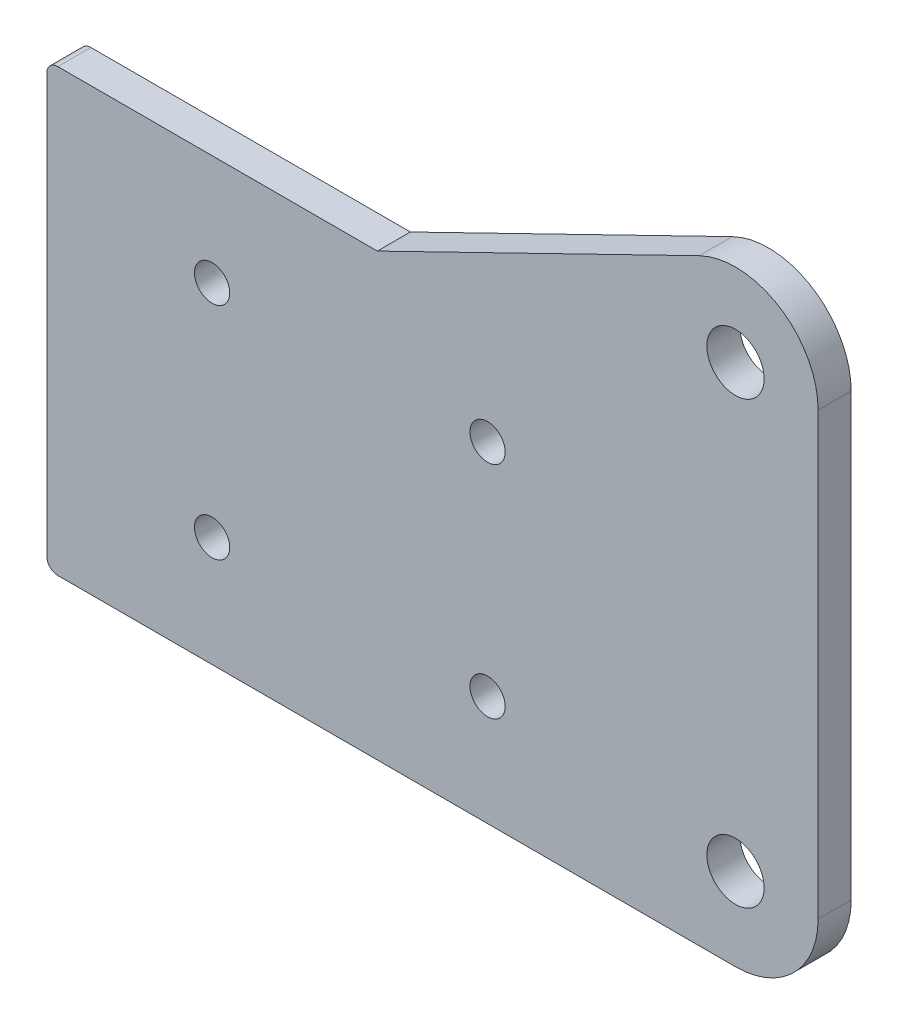
ISO-10303-21;
HEADER;
FILE_DESCRIPTION(('STEP AP214'),'2;1');
FILE_NAME('part.step','',(''),(''),'','','');
FILE_SCHEMA(('AUTOMOTIVE_DESIGN { 1 0 10303 214 1 1 1 1 }'));
ENDSEC;
DATA;
#1=APPLICATION_CONTEXT('core data for automotive mechanical design processes');
#2=APPLICATION_PROTOCOL_DEFINITION('international standard','automotive_design',2000,#1);
#3=PRODUCT_CONTEXT('',#1,'mechanical');
#4=PRODUCT('Part','Part','',(#3));
#5=PRODUCT_RELATED_PRODUCT_CATEGORY('part','',(#4));
#6=PRODUCT_DEFINITION_FORMATION('','',#4);
#7=PRODUCT_DEFINITION_CONTEXT('part definition',#1,'design');
#8=PRODUCT_DEFINITION('design','',#6,#7);
#9=PRODUCT_DEFINITION_SHAPE('','',#8);
#10=(LENGTH_UNIT() NAMED_UNIT(*) SI_UNIT(.MILLI.,.METRE.));
#11=(NAMED_UNIT(*) PLANE_ANGLE_UNIT() SI_UNIT($,.RADIAN.));
#12=(NAMED_UNIT(*) SI_UNIT($,.STERADIAN.) SOLID_ANGLE_UNIT());
#13=UNCERTAINTY_MEASURE_WITH_UNIT(LENGTH_MEASURE(1.E-05),#10,'distance_accuracy_value','');
#14=(GEOMETRIC_REPRESENTATION_CONTEXT(3) GLOBAL_UNCERTAINTY_ASSIGNED_CONTEXT((#13)) GLOBAL_UNIT_ASSIGNED_CONTEXT((#10,
#11,#12)) REPRESENTATION_CONTEXT('',''));
#15=CARTESIAN_POINT('',(0.,0.,0.));
#16=DIRECTION('',(0.,0.,1.));
#17=DIRECTION('',(1.,0.,0.));
#18=AXIS2_PLACEMENT_3D('',#15,#16,#17);
#19=CARTESIAN_POINT('',(27.5,20.,3.));
#20=DIRECTION('',(0.,0.,-1.));
#21=DIRECTION('',(-1.,0.,0.));
#22=AXIS2_PLACEMENT_3D('',#19,#20,#21);
#23=PLANE('',#22);
#24=CARTESIAN_POINT('',(-20.,-17.5,3.));
#25=DIRECTION('',(0.,0.,1.));
#26=DIRECTION('',(-1.,0.,0.));
#27=AXIS2_PLACEMENT_3D('',#24,#25,#26);
#28=CIRCLE('',#27,1.6);
#29=CARTESIAN_POINT('',(-21.6,-17.5,3.));
#30=VERTEX_POINT('',#29);
#31=EDGE_CURVE('E304',#30,#30,#28,.T.);
#32=ORIENTED_EDGE('',*,*,#31,.F.);
#33=EDGE_LOOP('',(#32));
#34=FACE_BOUND('',#33,.T.);
#35=CARTESIAN_POINT('',(4.99999999999999,-17.5,3.));
#36=DIRECTION('',(0.,0.,1.));
#37=DIRECTION('',(1.,0.,0.));
#38=AXIS2_PLACEMENT_3D('',#35,#36,#37);
#39=CIRCLE('',#38,1.6);
#40=CARTESIAN_POINT('',(6.59999999999999,-17.5,3.));
#41=VERTEX_POINT('',#40);
#42=EDGE_CURVE('E296',#41,#41,#39,.T.);
#43=ORIENTED_EDGE('',*,*,#42,.F.);
#44=EDGE_LOOP('',(#43));
#45=FACE_BOUND('',#44,.T.);
#46=CARTESIAN_POINT('',(4.99999999999999,2.49999999999999,3.));
#47=DIRECTION('',(0.,0.,1.));
#48=DIRECTION('',(-1.,0.,0.));
#49=AXIS2_PLACEMENT_3D('',#46,#47,#48);
#50=CIRCLE('',#49,1.6);
#51=CARTESIAN_POINT('',(3.39999999999999,2.49999999999999,3.));
#52=VERTEX_POINT('',#51);
#53=EDGE_CURVE('E289',#52,#52,#50,.T.);
#54=ORIENTED_EDGE('',*,*,#53,.F.);
#55=EDGE_LOOP('',(#54));
#56=FACE_BOUND('',#55,.T.);
#57=CARTESIAN_POINT('',(-20.,2.49999999999999,3.));
#58=DIRECTION('',(0.,0.,1.));
#59=DIRECTION('',(1.,0.,0.));
#60=AXIS2_PLACEMENT_3D('',#57,#58,#59);
#61=CIRCLE('',#60,1.6);
#62=CARTESIAN_POINT('',(-18.4,2.49999999999999,3.));
#63=VERTEX_POINT('',#62);
#64=EDGE_CURVE('E293',#63,#63,#61,.T.);
#65=ORIENTED_EDGE('',*,*,#64,.F.);
#66=EDGE_LOOP('',(#65));
#67=FACE_BOUND('',#66,.T.);
#68=DIRECTION('',(0.,-1.,0.));
#69=VECTOR('',#68,1.);
#70=CARTESIAN_POINT('',(-35.,-27.5,3.));
#71=LINE('',#70,#69);
#72=CARTESIAN_POINT('',(-35.,11.5,3.));
#73=VERTEX_POINT('',#72);
#74=CARTESIAN_POINT('',(-35.,-26.5,3.));
#75=VERTEX_POINT('',#74);
#76=EDGE_CURVE('E158',#73,#75,#71,.T.);
#77=ORIENTED_EDGE('',*,*,#76,.T.);
#78=CARTESIAN_POINT('',(-34.,-26.5,3.));
#79=DIRECTION('',(0.,0.,-1.));
#80=DIRECTION('',(-1.,0.,0.));
#81=AXIS2_PLACEMENT_3D('',#78,#79,#80);
#82=CIRCLE('',#81,1.);
#83=CARTESIAN_POINT('',(-34.,-27.5,3.));
#84=VERTEX_POINT('',#83);
#85=EDGE_CURVE('E46',#75,#84,#82,.F.);
#86=ORIENTED_EDGE('',*,*,#85,.T.);
#87=DIRECTION('',(1.,0.,0.));
#88=VECTOR('',#87,1.);
#89=CARTESIAN_POINT('',(-35.,-27.5,3.));
#90=LINE('',#89,#88);
#91=CARTESIAN_POINT('',(27.4999999999999,-27.5,3.));
#92=VERTEX_POINT('',#91);
#93=EDGE_CURVE('E160',#84,#92,#90,.T.);
#94=ORIENTED_EDGE('',*,*,#93,.T.);
#95=CARTESIAN_POINT('',(27.5,-20.,3.));
#96=DIRECTION('',(0.,0.,1.));
#97=DIRECTION('',(1.,0.,0.));
#98=AXIS2_PLACEMENT_3D('',#95,#96,#97);
#99=CIRCLE('',#98,7.5);
#100=CARTESIAN_POINT('',(35.,-20.,3.));
#101=VERTEX_POINT('',#100);
#102=EDGE_CURVE('E163',#92,#101,#99,.T.);
#103=ORIENTED_EDGE('',*,*,#102,.T.);
#104=DIRECTION('',(0.,1.,0.));
#105=VECTOR('',#104,1.);
#106=CARTESIAN_POINT('',(35.,-20.,3.));
#107=LINE('',#106,#105);
#108=CARTESIAN_POINT('',(35.,19.9999999999999,3.));
#109=VERTEX_POINT('',#108);
#110=EDGE_CURVE('E165',#101,#109,#107,.T.);
#111=ORIENTED_EDGE('',*,*,#110,.T.);
#112=CARTESIAN_POINT('',(27.5,20.,3.));
#113=DIRECTION('',(0.,0.,1.));
#114=DIRECTION('',(-1.,0.,0.));
#115=AXIS2_PLACEMENT_3D('',#112,#113,#114);
#116=CIRCLE('',#115,7.5);
#117=CARTESIAN_POINT('',(24.2134831460674,26.7415730337079,3.));
#118=VERTEX_POINT('',#117);
#119=EDGE_CURVE('E167',#109,#118,#116,.T.);
#120=ORIENTED_EDGE('',*,*,#119,.T.);
#121=DIRECTION('',(0.898876404494382,0.438202247191011,0.));
#122=VECTOR('',#121,1.);
#123=CARTESIAN_POINT('',(-5.00000000000001,12.5,3.));
#124=LINE('',#123,#122);
#125=CARTESIAN_POINT('',(-5.00000000000001,12.5,3.));
#126=VERTEX_POINT('',#125);
#127=EDGE_CURVE('E123',#126,#118,#124,.T.);
#128=ORIENTED_EDGE('',*,*,#127,.F.);
#129=DIRECTION('',(1.,0.,0.));
#130=VECTOR('',#129,1.);
#131=CARTESIAN_POINT('',(-35.,12.5,3.));
#132=LINE('',#131,#130);
#133=CARTESIAN_POINT('',(-34.,12.5,3.));
#134=VERTEX_POINT('',#133);
#135=EDGE_CURVE('E129',#134,#126,#132,.T.);
#136=ORIENTED_EDGE('',*,*,#135,.F.);
#137=CARTESIAN_POINT('',(-34.,11.5,3.));
#138=DIRECTION('',(0.,0.,-1.));
#139=DIRECTION('',(-1.,0.,0.));
#140=AXIS2_PLACEMENT_3D('',#137,#138,#139);
#141=CIRCLE('',#140,1.);
#142=EDGE_CURVE('E53',#134,#73,#141,.F.);
#143=ORIENTED_EDGE('',*,*,#142,.T.);
#144=EDGE_LOOP('',(#77,#86,#94,#103,#111,#120,#128,#136,#143));
#145=FACE_BOUND('',#144,.T.);
#146=CARTESIAN_POINT('',(27.5,20.,3.));
#147=DIRECTION('',(0.,0.,1.));
#148=DIRECTION('',(1.,0.,0.));
#149=AXIS2_PLACEMENT_3D('',#146,#147,#148);
#150=CIRCLE('',#149,2.6);
#151=CARTESIAN_POINT('',(30.1,20.,3.));
#152=VERTEX_POINT('',#151);
#153=EDGE_CURVE('E152',#152,#152,#150,.T.);
#154=ORIENTED_EDGE('',*,*,#153,.F.);
#155=EDGE_LOOP('',(#154));
#156=FACE_BOUND('',#155,.T.);
#157=CARTESIAN_POINT('',(27.5,-20.,3.));
#158=DIRECTION('',(0.,0.,1.));
#159=DIRECTION('',(-1.,0.,0.));
#160=AXIS2_PLACEMENT_3D('',#157,#158,#159);
#161=CIRCLE('',#160,2.6);
#162=CARTESIAN_POINT('',(24.9,-20.,3.));
#163=VERTEX_POINT('',#162);
#164=EDGE_CURVE('E146',#163,#163,#161,.T.);
#165=ORIENTED_EDGE('',*,*,#164,.F.);
#166=EDGE_LOOP('',(#165));
#167=FACE_BOUND('',#166,.T.);
#168=ADVANCED_FACE('F38',(#34,#45,#56,#67,#145,#156,#167),#23,.F.);
#169=CARTESIAN_POINT('',(27.5,20.,0.));
#170=DIRECTION('',(0.,0.,-1.));
#171=DIRECTION('',(-1.,0.,0.));
#172=AXIS2_PLACEMENT_3D('',#169,#170,#171);
#173=PLANE('',#172);
#174=CARTESIAN_POINT('',(-20.,-17.5,0.));
#175=DIRECTION('',(0.,0.,1.));
#176=DIRECTION('',(-1.,0.,0.));
#177=AXIS2_PLACEMENT_3D('',#174,#175,#176);
#178=CIRCLE('',#177,1.6);
#179=CARTESIAN_POINT('',(-21.6,-17.5,0.));
#180=VERTEX_POINT('',#179);
#181=EDGE_CURVE('E301',#180,#180,#178,.T.);
#182=ORIENTED_EDGE('',*,*,#181,.T.);
#183=EDGE_LOOP('',(#182));
#184=FACE_BOUND('',#183,.T.);
#185=CARTESIAN_POINT('',(4.99999999999999,-17.5,0.));
#186=DIRECTION('',(0.,0.,1.));
#187=DIRECTION('',(1.,0.,0.));
#188=AXIS2_PLACEMENT_3D('',#185,#186,#187);
#189=CIRCLE('',#188,1.6);
#190=CARTESIAN_POINT('',(6.59999999999999,-17.5,0.));
#191=VERTEX_POINT('',#190);
#192=EDGE_CURVE('E291',#191,#191,#189,.T.);
#193=ORIENTED_EDGE('',*,*,#192,.T.);
#194=EDGE_LOOP('',(#193));
#195=FACE_BOUND('',#194,.T.);
#196=CARTESIAN_POINT('',(4.99999999999999,2.49999999999999,0.));
#197=DIRECTION('',(0.,0.,1.));
#198=DIRECTION('',(-1.,0.,0.));
#199=AXIS2_PLACEMENT_3D('',#196,#197,#198);
#200=CIRCLE('',#199,1.6);
#201=CARTESIAN_POINT('',(3.39999999999999,2.49999999999999,0.));
#202=VERTEX_POINT('',#201);
#203=EDGE_CURVE('E286',#202,#202,#200,.T.);
#204=ORIENTED_EDGE('',*,*,#203,.T.);
#205=EDGE_LOOP('',(#204));
#206=FACE_BOUND('',#205,.T.);
#207=CARTESIAN_POINT('',(-20.,2.49999999999999,0.));
#208=DIRECTION('',(0.,0.,1.));
#209=DIRECTION('',(1.,0.,0.));
#210=AXIS2_PLACEMENT_3D('',#207,#208,#209);
#211=CIRCLE('',#210,1.6);
#212=CARTESIAN_POINT('',(-18.4,2.49999999999999,0.));
#213=VERTEX_POINT('',#212);
#214=EDGE_CURVE('E142',#213,#213,#211,.T.);
#215=ORIENTED_EDGE('',*,*,#214,.T.);
#216=EDGE_LOOP('',(#215));
#217=FACE_BOUND('',#216,.T.);
#218=DIRECTION('',(1.,0.,0.));
#219=VECTOR('',#218,1.);
#220=CARTESIAN_POINT('',(-35.,-27.5,0.));
#221=LINE('',#220,#219);
#222=CARTESIAN_POINT('',(-34.,-27.5,0.));
#223=VERTEX_POINT('',#222);
#224=CARTESIAN_POINT('',(27.4999999999999,-27.5,0.));
#225=VERTEX_POINT('',#224);
#226=EDGE_CURVE('E171',#223,#225,#221,.T.);
#227=ORIENTED_EDGE('',*,*,#226,.F.);
#228=CARTESIAN_POINT('',(-34.,-26.5,0.));
#229=DIRECTION('',(0.,0.,-1.));
#230=DIRECTION('',(-1.,0.,0.));
#231=AXIS2_PLACEMENT_3D('',#228,#229,#230);
#232=CIRCLE('',#231,1.);
#233=CARTESIAN_POINT('',(-35.,-26.5,0.));
#234=VERTEX_POINT('',#233);
#235=EDGE_CURVE('E190',#223,#234,#232,.T.);
#236=ORIENTED_EDGE('',*,*,#235,.T.);
#237=DIRECTION('',(0.,-1.,0.));
#238=VECTOR('',#237,1.);
#239=CARTESIAN_POINT('',(-35.,-27.5,0.));
#240=LINE('',#239,#238);
#241=CARTESIAN_POINT('',(-35.,11.5,0.));
#242=VERTEX_POINT('',#241);
#243=EDGE_CURVE('E155',#242,#234,#240,.T.);
#244=ORIENTED_EDGE('',*,*,#243,.F.);
#245=CARTESIAN_POINT('',(-34.,11.5,0.));
#246=DIRECTION('',(0.,0.,-1.));
#247=DIRECTION('',(-1.,0.,0.));
#248=AXIS2_PLACEMENT_3D('',#245,#246,#247);
#249=CIRCLE('',#248,1.);
#250=CARTESIAN_POINT('',(-34.,12.5,0.));
#251=VERTEX_POINT('',#250);
#252=EDGE_CURVE('E121',#242,#251,#249,.T.);
#253=ORIENTED_EDGE('',*,*,#252,.T.);
#254=DIRECTION('',(1.,0.,0.));
#255=VECTOR('',#254,1.);
#256=CARTESIAN_POINT('',(-35.,12.5,0.));
#257=LINE('',#256,#255);
#258=CARTESIAN_POINT('',(-5.00000000000001,12.5,0.));
#259=VERTEX_POINT('',#258);
#260=EDGE_CURVE('E111',#251,#259,#257,.T.);
#261=ORIENTED_EDGE('',*,*,#260,.T.);
#262=DIRECTION('',(0.898876404494382,0.438202247191011,0.));
#263=VECTOR('',#262,1.);
#264=CARTESIAN_POINT('',(-5.00000000000001,12.5,0.));
#265=LINE('',#264,#263);
#266=CARTESIAN_POINT('',(24.2134831460674,26.7415730337079,0.));
#267=VERTEX_POINT('',#266);
#268=EDGE_CURVE('E118',#259,#267,#265,.T.);
#269=ORIENTED_EDGE('',*,*,#268,.T.);
#270=CARTESIAN_POINT('',(27.5,20.,0.));
#271=DIRECTION('',(0.,0.,1.));
#272=DIRECTION('',(-1.,0.,0.));
#273=AXIS2_PLACEMENT_3D('',#270,#271,#272);
#274=CIRCLE('',#273,7.5);
#275=CARTESIAN_POINT('',(35.,19.9999999999999,0.));
#276=VERTEX_POINT('',#275);
#277=EDGE_CURVE('E161',#276,#267,#274,.T.);
#278=ORIENTED_EDGE('',*,*,#277,.F.);
#279=DIRECTION('',(0.,1.,0.));
#280=VECTOR('',#279,1.);
#281=CARTESIAN_POINT('',(35.,-20.,0.));
#282=LINE('',#281,#280);
#283=CARTESIAN_POINT('',(35.,-20.,0.));
#284=VERTEX_POINT('',#283);
#285=EDGE_CURVE('E175',#284,#276,#282,.T.);
#286=ORIENTED_EDGE('',*,*,#285,.F.);
#287=CARTESIAN_POINT('',(27.5,-20.,0.));
#288=DIRECTION('',(0.,0.,1.));
#289=DIRECTION('',(1.,0.,0.));
#290=AXIS2_PLACEMENT_3D('',#287,#288,#289);
#291=CIRCLE('',#290,7.5);
#292=EDGE_CURVE('E173',#225,#284,#291,.T.);
#293=ORIENTED_EDGE('',*,*,#292,.F.);
#294=EDGE_LOOP('',(#227,#236,#244,#253,#261,#269,#278,#286,#293));
#295=FACE_BOUND('',#294,.T.);
#296=CARTESIAN_POINT('',(27.5,20.,0.));
#297=DIRECTION('',(0.,0.,1.));
#298=DIRECTION('',(1.,0.,0.));
#299=AXIS2_PLACEMENT_3D('',#296,#297,#298);
#300=CIRCLE('',#299,2.6);
#301=CARTESIAN_POINT('',(30.1,20.,0.));
#302=VERTEX_POINT('',#301);
#303=EDGE_CURVE('E149',#302,#302,#300,.T.);
#304=ORIENTED_EDGE('',*,*,#303,.T.);
#305=EDGE_LOOP('',(#304));
#306=FACE_BOUND('',#305,.T.);
#307=CARTESIAN_POINT('',(27.5,-20.,0.));
#308=DIRECTION('',(0.,0.,1.));
#309=DIRECTION('',(-1.,0.,0.));
#310=AXIS2_PLACEMENT_3D('',#307,#308,#309);
#311=CIRCLE('',#310,2.6);
#312=CARTESIAN_POINT('',(24.9,-20.,0.));
#313=VERTEX_POINT('',#312);
#314=EDGE_CURVE('E144',#313,#313,#311,.T.);
#315=ORIENTED_EDGE('',*,*,#314,.T.);
#316=EDGE_LOOP('',(#315));
#317=FACE_BOUND('',#316,.T.);
#318=ADVANCED_FACE('F114',(#184,#195,#206,#217,#295,#306,#317),#173,.T.);
#319=CARTESIAN_POINT('',(-35.,-27.5,3.));
#320=DIRECTION('',(1.,0.,0.));
#321=DIRECTION('',(0.,0.,-1.));
#322=AXIS2_PLACEMENT_3D('',#319,#320,#321);
#323=PLANE('',#322);
#324=ORIENTED_EDGE('',*,*,#243,.T.);
#325=DIRECTION('',(0.,0.,-1.));
#326=VECTOR('',#325,1.);
#327=CARTESIAN_POINT('',(-35.,-26.5,3.));
#328=LINE('',#327,#326);
#329=EDGE_CURVE('E60',#234,#75,#328,.F.);
#330=ORIENTED_EDGE('',*,*,#329,.T.);
#331=ORIENTED_EDGE('',*,*,#76,.F.);
#332=DIRECTION('',(0.,0.,1.));
#333=VECTOR('',#332,1.);
#334=CARTESIAN_POINT('',(-35.,11.5,3.));
#335=LINE('',#334,#333);
#336=EDGE_CURVE('E192',#73,#242,#335,.F.);
#337=ORIENTED_EDGE('',*,*,#336,.T.);
#338=EDGE_LOOP('',(#324,#330,#331,#337));
#339=FACE_BOUND('',#338,.T.);
#340=ADVANCED_FACE('F207',(#339),#323,.F.);
#341=CARTESIAN_POINT('',(-35.,-27.5,3.));
#342=DIRECTION('',(0.,1.,0.));
#343=DIRECTION('',(0.,0.,1.));
#344=AXIS2_PLACEMENT_3D('',#341,#342,#343);
#345=PLANE('',#344);
#346=ORIENTED_EDGE('',*,*,#93,.F.);
#347=DIRECTION('',(0.,0.,-1.));
#348=VECTOR('',#347,1.);
#349=CARTESIAN_POINT('',(-34.,-27.5,3.));
#350=LINE('',#349,#348);
#351=EDGE_CURVE('E186',#84,#223,#350,.T.);
#352=ORIENTED_EDGE('',*,*,#351,.T.);
#353=ORIENTED_EDGE('',*,*,#226,.T.);
#354=DIRECTION('',(0.,0.,-1.));
#355=VECTOR('',#354,1.);
#356=CARTESIAN_POINT('',(27.4999999999999,-27.5,3.));
#357=LINE('',#356,#355);
#358=EDGE_CURVE('E183',#92,#225,#357,.T.);
#359=ORIENTED_EDGE('',*,*,#358,.F.);
#360=EDGE_LOOP('',(#346,#352,#353,#359));
#361=FACE_BOUND('',#360,.T.);
#362=ADVANCED_FACE('F203',(#361),#345,.F.);
#363=CARTESIAN_POINT('',(27.5,-20.,3.));
#364=DIRECTION('',(0.,0.,-1.));
#365=DIRECTION('',(-1.,0.,0.));
#366=AXIS2_PLACEMENT_3D('',#363,#364,#365);
#367=CYLINDRICAL_SURFACE('',#366,7.5);
#368=ORIENTED_EDGE('',*,*,#292,.T.);
#369=DIRECTION('',(0.,0.,-1.));
#370=VECTOR('',#369,1.);
#371=CARTESIAN_POINT('',(35.,-20.,3.));
#372=LINE('',#371,#370);
#373=EDGE_CURVE('E180',#101,#284,#372,.T.);
#374=ORIENTED_EDGE('',*,*,#373,.F.);
#375=ORIENTED_EDGE('',*,*,#102,.F.);
#376=ORIENTED_EDGE('',*,*,#358,.T.);
#377=EDGE_LOOP('',(#368,#374,#375,#376));
#378=FACE_BOUND('',#377,.T.);
#379=ADVANCED_FACE('F218',(#378),#367,.T.);
#380=CARTESIAN_POINT('',(35.,-20.,3.));
#381=DIRECTION('',(-1.,0.,0.));
#382=DIRECTION('',(0.,0.,1.));
#383=AXIS2_PLACEMENT_3D('',#380,#381,#382);
#384=PLANE('',#383);
#385=ORIENTED_EDGE('',*,*,#285,.T.);
#386=DIRECTION('',(0.,0.,-1.));
#387=VECTOR('',#386,1.);
#388=CARTESIAN_POINT('',(35.,19.9999999999999,3.));
#389=LINE('',#388,#387);
#390=EDGE_CURVE('E169',#109,#276,#389,.T.);
#391=ORIENTED_EDGE('',*,*,#390,.F.);
#392=ORIENTED_EDGE('',*,*,#110,.F.);
#393=ORIENTED_EDGE('',*,*,#373,.T.);
#394=EDGE_LOOP('',(#385,#391,#392,#393));
#395=FACE_BOUND('',#394,.T.);
#396=ADVANCED_FACE('F215',(#395),#384,.F.);
#397=CARTESIAN_POINT('',(27.5,20.,3.));
#398=DIRECTION('',(0.,0.,-1.));
#399=DIRECTION('',(-1.,0.,0.));
#400=AXIS2_PLACEMENT_3D('',#397,#398,#399);
#401=CYLINDRICAL_SURFACE('',#400,7.5);
#402=ORIENTED_EDGE('',*,*,#277,.T.);
#403=DIRECTION('',(0.,0.,1.));
#404=VECTOR('',#403,1.);
#405=CARTESIAN_POINT('',(24.2134831460674,26.7415730337079,0.));
#406=LINE('',#405,#404);
#407=EDGE_CURVE('E133',#267,#118,#406,.T.);
#408=ORIENTED_EDGE('',*,*,#407,.T.);
#409=ORIENTED_EDGE('',*,*,#119,.F.);
#410=ORIENTED_EDGE('',*,*,#390,.T.);
#411=EDGE_LOOP('',(#402,#408,#409,#410));
#412=FACE_BOUND('',#411,.T.);
#413=ADVANCED_FACE('F212',(#412),#401,.T.);
#414=CARTESIAN_POINT('',(27.5,20.,3.));
#415=DIRECTION('',(0.,0.,-1.));
#416=DIRECTION('',(-1.,0.,0.));
#417=AXIS2_PLACEMENT_3D('',#414,#415,#416);
#418=CYLINDRICAL_SURFACE('',#417,2.6);
#419=ORIENTED_EDGE('',*,*,#153,.T.);
#420=EDGE_LOOP('',(#419));
#421=FACE_BOUND('',#420,.T.);
#422=ORIENTED_EDGE('',*,*,#303,.F.);
#423=EDGE_LOOP('',(#422));
#424=FACE_BOUND('',#423,.T.);
#425=ADVANCED_FACE('F238',(#421,#424),#418,.F.);
#426=CARTESIAN_POINT('',(27.5,-20.,3.));
#427=DIRECTION('',(0.,0.,-1.));
#428=DIRECTION('',(-1.,0.,0.));
#429=AXIS2_PLACEMENT_3D('',#426,#427,#428);
#430=CYLINDRICAL_SURFACE('',#429,2.6);
#431=ORIENTED_EDGE('',*,*,#164,.T.);
#432=EDGE_LOOP('',(#431));
#433=FACE_BOUND('',#432,.T.);
#434=ORIENTED_EDGE('',*,*,#314,.F.);
#435=EDGE_LOOP('',(#434));
#436=FACE_BOUND('',#435,.T.);
#437=ADVANCED_FACE('F245',(#433,#436),#430,.F.);
#438=CARTESIAN_POINT('',(-5.00000000000001,12.5,0.));
#439=DIRECTION('',(0.438202247191011,-0.898876404494382,0.));
#440=DIRECTION('',(0.898876404494382,0.438202247191011,0.));
#441=AXIS2_PLACEMENT_3D('',#438,#439,#440);
#442=PLANE('',#441);
#443=ORIENTED_EDGE('',*,*,#127,.T.);
#444=ORIENTED_EDGE('',*,*,#407,.F.);
#445=ORIENTED_EDGE('',*,*,#268,.F.);
#446=DIRECTION('',(0.,0.,1.));
#447=VECTOR('',#446,1.);
#448=CARTESIAN_POINT('',(-5.00000000000001,12.5,0.));
#449=LINE('',#448,#447);
#450=EDGE_CURVE('E126',#259,#126,#449,.T.);
#451=ORIENTED_EDGE('',*,*,#450,.T.);
#452=EDGE_LOOP('',(#443,#444,#445,#451));
#453=FACE_BOUND('',#452,.T.);
#454=ADVANCED_FACE('F136',(#453),#442,.F.);
#455=CARTESIAN_POINT('',(-35.,12.5,0.));
#456=DIRECTION('',(0.,-1.,0.));
#457=DIRECTION('',(0.,0.,-1.));
#458=AXIS2_PLACEMENT_3D('',#455,#456,#457);
#459=PLANE('',#458);
#460=ORIENTED_EDGE('',*,*,#260,.F.);
#461=DIRECTION('',(0.,0.,1.));
#462=VECTOR('',#461,1.);
#463=CARTESIAN_POINT('',(-34.,12.5,0.));
#464=LINE('',#463,#462);
#465=EDGE_CURVE('E11',#251,#134,#464,.T.);
#466=ORIENTED_EDGE('',*,*,#465,.T.);
#467=ORIENTED_EDGE('',*,*,#135,.T.);
#468=ORIENTED_EDGE('',*,*,#450,.F.);
#469=EDGE_LOOP('',(#460,#466,#467,#468));
#470=FACE_BOUND('',#469,.T.);
#471=ADVANCED_FACE('F127',(#470),#459,.F.);
#472=CARTESIAN_POINT('',(-20.,2.49999999999999,0.));
#473=DIRECTION('',(0.,0.,1.));
#474=DIRECTION('',(1.,0.,0.));
#475=AXIS2_PLACEMENT_3D('',#472,#473,#474);
#476=CYLINDRICAL_SURFACE('',#475,1.6);
#477=ORIENTED_EDGE('',*,*,#214,.F.);
#478=EDGE_LOOP('',(#477));
#479=FACE_BOUND('',#478,.T.);
#480=ORIENTED_EDGE('',*,*,#64,.T.);
#481=EDGE_LOOP('',(#480));
#482=FACE_BOUND('',#481,.T.);
#483=ADVANCED_FACE('F265',(#479,#482),#476,.F.);
#484=CARTESIAN_POINT('',(4.99999999999999,2.49999999999999,0.));
#485=DIRECTION('',(0.,0.,1.));
#486=DIRECTION('',(1.,0.,0.));
#487=AXIS2_PLACEMENT_3D('',#484,#485,#486);
#488=CYLINDRICAL_SURFACE('',#487,1.6);
#489=ORIENTED_EDGE('',*,*,#203,.F.);
#490=EDGE_LOOP('',(#489));
#491=FACE_BOUND('',#490,.T.);
#492=ORIENTED_EDGE('',*,*,#53,.T.);
#493=EDGE_LOOP('',(#492));
#494=FACE_BOUND('',#493,.T.);
#495=ADVANCED_FACE('F269',(#491,#494),#488,.F.);
#496=CARTESIAN_POINT('',(4.99999999999999,-17.5,0.));
#497=DIRECTION('',(0.,0.,1.));
#498=DIRECTION('',(1.,0.,0.));
#499=AXIS2_PLACEMENT_3D('',#496,#497,#498);
#500=CYLINDRICAL_SURFACE('',#499,1.6);
#501=ORIENTED_EDGE('',*,*,#192,.F.);
#502=EDGE_LOOP('',(#501));
#503=FACE_BOUND('',#502,.T.);
#504=ORIENTED_EDGE('',*,*,#42,.T.);
#505=EDGE_LOOP('',(#504));
#506=FACE_BOUND('',#505,.T.);
#507=ADVANCED_FACE('F274',(#503,#506),#500,.F.);
#508=CARTESIAN_POINT('',(-20.,-17.5,0.));
#509=DIRECTION('',(0.,0.,1.));
#510=DIRECTION('',(1.,0.,0.));
#511=AXIS2_PLACEMENT_3D('',#508,#509,#510);
#512=CYLINDRICAL_SURFACE('',#511,1.6);
#513=ORIENTED_EDGE('',*,*,#181,.F.);
#514=EDGE_LOOP('',(#513));
#515=FACE_BOUND('',#514,.T.);
#516=ORIENTED_EDGE('',*,*,#31,.T.);
#517=EDGE_LOOP('',(#516));
#518=FACE_BOUND('',#517,.T.);
#519=ADVANCED_FACE('F271',(#515,#518),#512,.F.);
#520=CARTESIAN_POINT('',(-34.,-26.5,3.));
#521=DIRECTION('',(0.,0.,-1.));
#522=DIRECTION('',(-1.,0.,0.));
#523=AXIS2_PLACEMENT_3D('',#520,#521,#522);
#524=CYLINDRICAL_SURFACE('',#523,1.);
#525=ORIENTED_EDGE('',*,*,#85,.F.);
#526=ORIENTED_EDGE('',*,*,#329,.F.);
#527=ORIENTED_EDGE('',*,*,#235,.F.);
#528=ORIENTED_EDGE('',*,*,#351,.F.);
#529=EDGE_LOOP('',(#525,#526,#527,#528));
#530=FACE_BOUND('',#529,.T.);
#531=ADVANCED_FACE('F205',(#530),#524,.T.);
#532=CARTESIAN_POINT('',(-34.,11.5,0.));
#533=DIRECTION('',(0.,0.,1.));
#534=DIRECTION('',(1.,0.,0.));
#535=AXIS2_PLACEMENT_3D('',#532,#533,#534);
#536=CYLINDRICAL_SURFACE('',#535,1.);
#537=ORIENTED_EDGE('',*,*,#252,.F.);
#538=ORIENTED_EDGE('',*,*,#336,.F.);
#539=ORIENTED_EDGE('',*,*,#142,.F.);
#540=ORIENTED_EDGE('',*,*,#465,.F.);
#541=EDGE_LOOP('',(#537,#538,#539,#540));
#542=FACE_BOUND('',#541,.T.);
#543=ADVANCED_FACE('F40',(#542),#536,.T.);
#544=CLOSED_SHELL('',(#168,#318,#340,#362,#379,#396,#413,#425,#437,#454,#471,#483,#495,#507,
#519,#531,#543));
#545=MANIFOLD_SOLID_BREP('B2',#544);
#546=ADVANCED_BREP_SHAPE_REPRESENTATION('',(#18,#545),#14);
#547=SHAPE_DEFINITION_REPRESENTATION(#9,#546);
ENDSEC;
END-ISO-10303-21;
